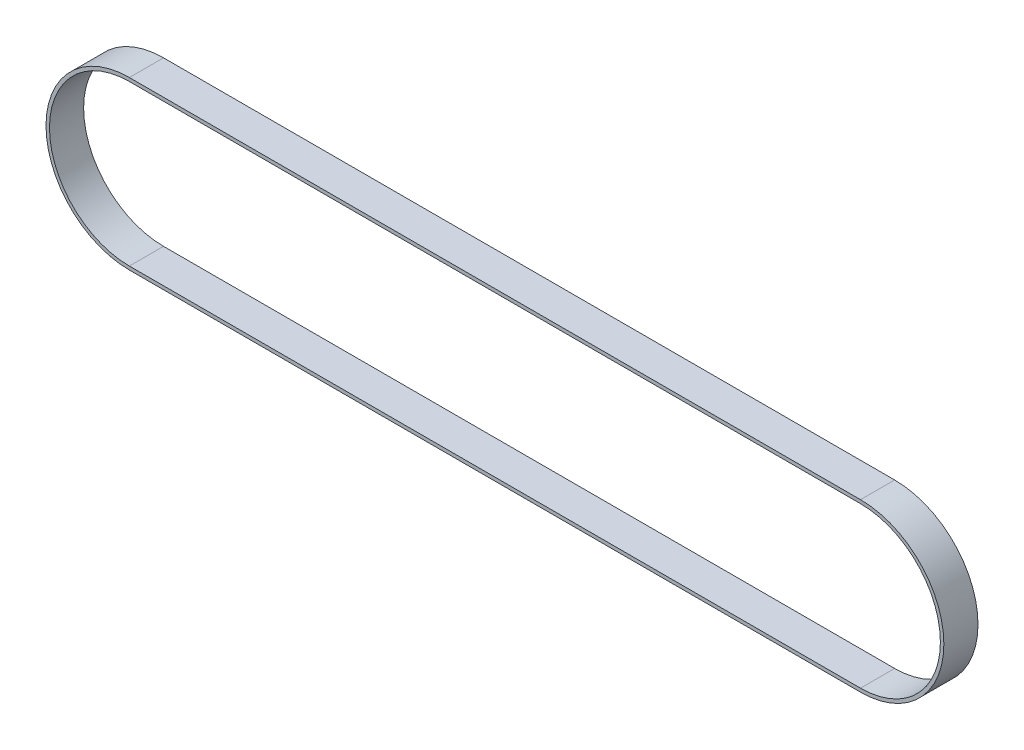
ISO-10303-21;
HEADER;
FILE_DESCRIPTION(('STEP AP214'),'2;1');
FILE_NAME('part.step','',(''),(''),'','','');
FILE_SCHEMA(('AUTOMOTIVE_DESIGN { 1 0 10303 214 1 1 1 1 }'));
ENDSEC;
DATA;
#1=APPLICATION_CONTEXT('core data for automotive mechanical design processes');
#2=APPLICATION_PROTOCOL_DEFINITION('international standard','automotive_design',2000,#1);
#3=PRODUCT_CONTEXT('',#1,'mechanical');
#4=PRODUCT('Part','Part','',(#3));
#5=PRODUCT_RELATED_PRODUCT_CATEGORY('part','',(#4));
#6=PRODUCT_DEFINITION_FORMATION('','',#4);
#7=PRODUCT_DEFINITION_CONTEXT('part definition',#1,'design');
#8=PRODUCT_DEFINITION('design','',#6,#7);
#9=PRODUCT_DEFINITION_SHAPE('','',#8);
#10=(LENGTH_UNIT() NAMED_UNIT(*) SI_UNIT(.MILLI.,.METRE.));
#11=(NAMED_UNIT(*) PLANE_ANGLE_UNIT() SI_UNIT($,.RADIAN.));
#12=(NAMED_UNIT(*) SI_UNIT($,.STERADIAN.) SOLID_ANGLE_UNIT());
#13=UNCERTAINTY_MEASURE_WITH_UNIT(LENGTH_MEASURE(1.E-05),#10,'distance_accuracy_value','');
#14=(GEOMETRIC_REPRESENTATION_CONTEXT(3) GLOBAL_UNCERTAINTY_ASSIGNED_CONTEXT((#13)) GLOBAL_UNIT_ASSIGNED_CONTEXT((#10,
#11,#12)) REPRESENTATION_CONTEXT('',''));
#15=CARTESIAN_POINT('',(0.,0.,0.));
#16=DIRECTION('',(0.,0.,1.));
#17=DIRECTION('',(1.,0.,0.));
#18=AXIS2_PLACEMENT_3D('',#15,#16,#17);
#19=CARTESIAN_POINT('',(0.,0.,14.986));
#20=DIRECTION('',(0.,0.,-1.));
#21=DIRECTION('',(-1.,0.,0.));
#22=AXIS2_PLACEMENT_3D('',#19,#20,#21);
#23=PLANE('',#22);
#24=CARTESIAN_POINT('',(0.,0.,14.986));
#25=DIRECTION('',(0.,0.,1.));
#26=DIRECTION('',(-1.,0.,0.));
#27=AXIS2_PLACEMENT_3D('',#24,#25,#26);
#28=CIRCLE('',#27,36.576);
#29=CARTESIAN_POINT('',(0.,-36.576,14.986));
#30=VERTEX_POINT('',#29);
#31=CARTESIAN_POINT('',(0.,36.5760000000001,14.986));
#32=VERTEX_POINT('',#31);
#33=EDGE_CURVE('E136',#30,#32,#28,.T.);
#34=ORIENTED_EDGE('',*,*,#33,.T.);
#35=DIRECTION('',(-1.,0.,0.));
#36=VECTOR('',#35,1.);
#37=CARTESIAN_POINT('',(0.,36.5760000000001,14.986));
#38=LINE('',#37,#36);
#39=CARTESIAN_POINT('',(-320.802,36.576,14.986));
#40=VERTEX_POINT('',#39);
#41=EDGE_CURVE('E139',#32,#40,#38,.T.);
#42=ORIENTED_EDGE('',*,*,#41,.T.);
#43=CARTESIAN_POINT('',(-320.802,0.,14.986));
#44=DIRECTION('',(0.,0.,1.));
#45=DIRECTION('',(1.,0.,0.));
#46=AXIS2_PLACEMENT_3D('',#43,#44,#45);
#47=CIRCLE('',#46,36.576);
#48=CARTESIAN_POINT('',(-320.802,-36.576,14.986));
#49=VERTEX_POINT('',#48);
#50=EDGE_CURVE('E142',#40,#49,#47,.T.);
#51=ORIENTED_EDGE('',*,*,#50,.T.);
#52=DIRECTION('',(1.,0.,0.));
#53=VECTOR('',#52,1.);
#54=CARTESIAN_POINT('',(0.,-36.576,14.986));
#55=LINE('',#54,#53);
#56=EDGE_CURVE('E144',#49,#30,#55,.T.);
#57=ORIENTED_EDGE('',*,*,#56,.T.);
#58=EDGE_LOOP('',(#34,#42,#51,#57));
#59=FACE_BOUND('',#58,.T.);
#60=CARTESIAN_POINT('',(0.,0.,14.986));
#61=DIRECTION('',(0.,0.,1.));
#62=DIRECTION('',(-1.,0.,0.));
#63=AXIS2_PLACEMENT_3D('',#60,#61,#62);
#64=CIRCLE('',#63,35.052);
#65=CARTESIAN_POINT('',(0.,-35.052,14.986));
#66=VERTEX_POINT('',#65);
#67=CARTESIAN_POINT('',(0.,35.052,14.986));
#68=VERTEX_POINT('',#67);
#69=EDGE_CURVE('E100',#66,#68,#64,.T.);
#70=ORIENTED_EDGE('',*,*,#69,.F.);
#71=DIRECTION('',(1.,0.,0.));
#72=VECTOR('',#71,1.);
#73=CARTESIAN_POINT('',(0.,-35.052,14.986));
#74=LINE('',#73,#72);
#75=CARTESIAN_POINT('',(-320.802,-35.052,14.986));
#76=VERTEX_POINT('',#75);
#77=EDGE_CURVE('E122',#76,#66,#74,.T.);
#78=ORIENTED_EDGE('',*,*,#77,.F.);
#79=CARTESIAN_POINT('',(-320.802,0.,14.986));
#80=DIRECTION('',(0.,0.,1.));
#81=DIRECTION('',(1.,0.,0.));
#82=AXIS2_PLACEMENT_3D('',#79,#80,#81);
#83=CIRCLE('',#82,35.052);
#84=CARTESIAN_POINT('',(-320.802,35.052,14.986));
#85=VERTEX_POINT('',#84);
#86=EDGE_CURVE('E120',#85,#76,#83,.T.);
#87=ORIENTED_EDGE('',*,*,#86,.F.);
#88=DIRECTION('',(-1.,0.,0.));
#89=VECTOR('',#88,1.);
#90=CARTESIAN_POINT('',(0.,35.052,14.986));
#91=LINE('',#90,#89);
#92=EDGE_CURVE('E108',#68,#85,#91,.T.);
#93=ORIENTED_EDGE('',*,*,#92,.F.);
#94=EDGE_LOOP('',(#70,#78,#87,#93));
#95=FACE_BOUND('',#94,.T.);
#96=ADVANCED_FACE('F35',(#59,#95),#23,.F.);
#97=CARTESIAN_POINT('',(0.,0.,0.));
#98=DIRECTION('',(0.,0.,-1.));
#99=DIRECTION('',(-1.,0.,0.));
#100=AXIS2_PLACEMENT_3D('',#97,#98,#99);
#101=PLANE('',#100);
#102=CARTESIAN_POINT('',(0.,0.,0.));
#103=DIRECTION('',(0.,0.,1.));
#104=DIRECTION('',(-1.,0.,0.));
#105=AXIS2_PLACEMENT_3D('',#102,#103,#104);
#106=CIRCLE('',#105,36.576);
#107=CARTESIAN_POINT('',(0.,-36.576,0.));
#108=VERTEX_POINT('',#107);
#109=CARTESIAN_POINT('',(0.,36.5760000000001,0.));
#110=VERTEX_POINT('',#109);
#111=EDGE_CURVE('E116',#108,#110,#106,.T.);
#112=ORIENTED_EDGE('',*,*,#111,.F.);
#113=DIRECTION('',(1.,0.,0.));
#114=VECTOR('',#113,1.);
#115=CARTESIAN_POINT('',(0.,-36.576,0.));
#116=LINE('',#115,#114);
#117=CARTESIAN_POINT('',(-320.802,-36.576,0.));
#118=VERTEX_POINT('',#117);
#119=EDGE_CURVE('E140',#118,#108,#116,.T.);
#120=ORIENTED_EDGE('',*,*,#119,.F.);
#121=CARTESIAN_POINT('',(-320.802,0.,0.));
#122=DIRECTION('',(0.,0.,1.));
#123=DIRECTION('',(1.,0.,0.));
#124=AXIS2_PLACEMENT_3D('',#121,#122,#123);
#125=CIRCLE('',#124,36.576);
#126=CARTESIAN_POINT('',(-320.802,36.576,0.));
#127=VERTEX_POINT('',#126);
#128=EDGE_CURVE('E151',#127,#118,#125,.T.);
#129=ORIENTED_EDGE('',*,*,#128,.F.);
#130=DIRECTION('',(-1.,0.,0.));
#131=VECTOR('',#130,1.);
#132=CARTESIAN_POINT('',(0.,36.5760000000001,0.));
#133=LINE('',#132,#131);
#134=EDGE_CURVE('E149',#110,#127,#133,.T.);
#135=ORIENTED_EDGE('',*,*,#134,.F.);
#136=EDGE_LOOP('',(#112,#120,#129,#135));
#137=FACE_BOUND('',#136,.T.);
#138=DIRECTION('',(1.,0.,0.));
#139=VECTOR('',#138,1.);
#140=CARTESIAN_POINT('',(0.,-35.052,0.));
#141=LINE('',#140,#139);
#142=CARTESIAN_POINT('',(-320.802,-35.052,0.));
#143=VERTEX_POINT('',#142);
#144=CARTESIAN_POINT('',(0.,-35.052,0.));
#145=VERTEX_POINT('',#144);
#146=EDGE_CURVE('E109',#143,#145,#141,.T.);
#147=ORIENTED_EDGE('',*,*,#146,.T.);
#148=CARTESIAN_POINT('',(0.,0.,0.));
#149=DIRECTION('',(0.,0.,1.));
#150=DIRECTION('',(-1.,0.,0.));
#151=AXIS2_PLACEMENT_3D('',#148,#149,#150);
#152=CIRCLE('',#151,35.052);
#153=CARTESIAN_POINT('',(0.,35.052,0.));
#154=VERTEX_POINT('',#153);
#155=EDGE_CURVE('E58',#145,#154,#152,.T.);
#156=ORIENTED_EDGE('',*,*,#155,.T.);
#157=DIRECTION('',(-1.,0.,0.));
#158=VECTOR('',#157,1.);
#159=CARTESIAN_POINT('',(0.,35.052,0.));
#160=LINE('',#159,#158);
#161=CARTESIAN_POINT('',(-320.802,35.052,0.));
#162=VERTEX_POINT('',#161);
#163=EDGE_CURVE('E115',#154,#162,#160,.T.);
#164=ORIENTED_EDGE('',*,*,#163,.T.);
#165=CARTESIAN_POINT('',(-320.802,0.,0.));
#166=DIRECTION('',(0.,0.,1.));
#167=DIRECTION('',(1.,0.,0.));
#168=AXIS2_PLACEMENT_3D('',#165,#166,#167);
#169=CIRCLE('',#168,35.052);
#170=EDGE_CURVE('E128',#162,#143,#169,.T.);
#171=ORIENTED_EDGE('',*,*,#170,.T.);
#172=EDGE_LOOP('',(#147,#156,#164,#171));
#173=FACE_BOUND('',#172,.T.);
#174=ADVANCED_FACE('F169',(#137,#173),#101,.T.);
#175=CARTESIAN_POINT('',(0.,0.,14.986));
#176=DIRECTION('',(0.,0.,-1.));
#177=DIRECTION('',(-1.,0.,0.));
#178=AXIS2_PLACEMENT_3D('',#175,#176,#177);
#179=CYLINDRICAL_SURFACE('',#178,36.576);
#180=ORIENTED_EDGE('',*,*,#111,.T.);
#181=DIRECTION('',(0.,0.,-1.));
#182=VECTOR('',#181,1.);
#183=CARTESIAN_POINT('',(0.,36.5760000000001,14.986));
#184=LINE('',#183,#182);
#185=EDGE_CURVE('E11',#32,#110,#184,.T.);
#186=ORIENTED_EDGE('',*,*,#185,.F.);
#187=ORIENTED_EDGE('',*,*,#33,.F.);
#188=DIRECTION('',(0.,0.,-1.));
#189=VECTOR('',#188,1.);
#190=CARTESIAN_POINT('',(0.,-36.576,14.986));
#191=LINE('',#190,#189);
#192=EDGE_CURVE('E146',#30,#108,#191,.T.);
#193=ORIENTED_EDGE('',*,*,#192,.T.);
#194=EDGE_LOOP('',(#180,#186,#187,#193));
#195=FACE_BOUND('',#194,.T.);
#196=ADVANCED_FACE('F37',(#195),#179,.T.);
#197=CARTESIAN_POINT('',(0.,36.5760000000001,14.986));
#198=DIRECTION('',(0.,-1.,0.));
#199=DIRECTION('',(1.,0.,0.));
#200=AXIS2_PLACEMENT_3D('',#197,#198,#199);
#201=PLANE('',#200);
#202=ORIENTED_EDGE('',*,*,#134,.T.);
#203=DIRECTION('',(0.,0.,-1.));
#204=VECTOR('',#203,1.);
#205=CARTESIAN_POINT('',(-320.802,36.576,14.986));
#206=LINE('',#205,#204);
#207=EDGE_CURVE('E43',#40,#127,#206,.T.);
#208=ORIENTED_EDGE('',*,*,#207,.F.);
#209=ORIENTED_EDGE('',*,*,#41,.F.);
#210=ORIENTED_EDGE('',*,*,#185,.T.);
#211=EDGE_LOOP('',(#202,#208,#209,#210));
#212=FACE_BOUND('',#211,.T.);
#213=ADVANCED_FACE('F179',(#212),#201,.F.);
#214=CARTESIAN_POINT('',(-320.802,0.,14.986));
#215=DIRECTION('',(0.,0.,-1.));
#216=DIRECTION('',(-1.,0.,0.));
#217=AXIS2_PLACEMENT_3D('',#214,#215,#216);
#218=CYLINDRICAL_SURFACE('',#217,36.576);
#219=ORIENTED_EDGE('',*,*,#128,.T.);
#220=DIRECTION('',(0.,0.,-1.));
#221=VECTOR('',#220,1.);
#222=CARTESIAN_POINT('',(-320.802,-36.576,14.986));
#223=LINE('',#222,#221);
#224=EDGE_CURVE('E156',#49,#118,#223,.T.);
#225=ORIENTED_EDGE('',*,*,#224,.F.);
#226=ORIENTED_EDGE('',*,*,#50,.F.);
#227=ORIENTED_EDGE('',*,*,#207,.T.);
#228=EDGE_LOOP('',(#219,#225,#226,#227));
#229=FACE_BOUND('',#228,.T.);
#230=ADVANCED_FACE('F163',(#229),#218,.T.);
#231=CARTESIAN_POINT('',(0.,-36.576,14.986));
#232=DIRECTION('',(0.,1.,0.));
#233=DIRECTION('',(-1.,0.,0.));
#234=AXIS2_PLACEMENT_3D('',#231,#232,#233);
#235=PLANE('',#234);
#236=ORIENTED_EDGE('',*,*,#119,.T.);
#237=ORIENTED_EDGE('',*,*,#192,.F.);
#238=ORIENTED_EDGE('',*,*,#56,.F.);
#239=ORIENTED_EDGE('',*,*,#224,.T.);
#240=EDGE_LOOP('',(#236,#237,#238,#239));
#241=FACE_BOUND('',#240,.T.);
#242=ADVANCED_FACE('F173',(#241),#235,.F.);
#243=CARTESIAN_POINT('',(0.,0.,14.986));
#244=DIRECTION('',(0.,0.,-1.));
#245=DIRECTION('',(-1.,0.,0.));
#246=AXIS2_PLACEMENT_3D('',#243,#244,#245);
#247=CYLINDRICAL_SURFACE('',#246,35.052);
#248=ORIENTED_EDGE('',*,*,#155,.F.);
#249=DIRECTION('',(0.,0.,-1.));
#250=VECTOR('',#249,1.);
#251=CARTESIAN_POINT('',(0.,-35.052,14.986));
#252=LINE('',#251,#250);
#253=EDGE_CURVE('E104',#66,#145,#252,.T.);
#254=ORIENTED_EDGE('',*,*,#253,.F.);
#255=ORIENTED_EDGE('',*,*,#69,.T.);
#256=DIRECTION('',(0.,0.,-1.));
#257=VECTOR('',#256,1.);
#258=CARTESIAN_POINT('',(0.,35.052,14.986));
#259=LINE('',#258,#257);
#260=EDGE_CURVE('E103',#68,#154,#259,.T.);
#261=ORIENTED_EDGE('',*,*,#260,.T.);
#262=EDGE_LOOP('',(#248,#254,#255,#261));
#263=FACE_BOUND('',#262,.T.);
#264=ADVANCED_FACE('F102',(#263),#247,.F.);
#265=CARTESIAN_POINT('',(0.,35.052,14.986));
#266=DIRECTION('',(0.,-1.,0.));
#267=DIRECTION('',(1.,0.,0.));
#268=AXIS2_PLACEMENT_3D('',#265,#266,#267);
#269=PLANE('',#268);
#270=ORIENTED_EDGE('',*,*,#163,.F.);
#271=ORIENTED_EDGE('',*,*,#260,.F.);
#272=ORIENTED_EDGE('',*,*,#92,.T.);
#273=DIRECTION('',(0.,0.,-1.));
#274=VECTOR('',#273,1.);
#275=CARTESIAN_POINT('',(-320.802,35.052,14.986));
#276=LINE('',#275,#274);
#277=EDGE_CURVE('E117',#85,#162,#276,.T.);
#278=ORIENTED_EDGE('',*,*,#277,.T.);
#279=EDGE_LOOP('',(#270,#271,#272,#278));
#280=FACE_BOUND('',#279,.T.);
#281=ADVANCED_FACE('F112',(#280),#269,.T.);
#282=CARTESIAN_POINT('',(-320.802,0.,14.986));
#283=DIRECTION('',(0.,0.,-1.));
#284=DIRECTION('',(-1.,0.,0.));
#285=AXIS2_PLACEMENT_3D('',#282,#283,#284);
#286=CYLINDRICAL_SURFACE('',#285,35.052);
#287=ORIENTED_EDGE('',*,*,#170,.F.);
#288=ORIENTED_EDGE('',*,*,#277,.F.);
#289=ORIENTED_EDGE('',*,*,#86,.T.);
#290=DIRECTION('',(0.,0.,-1.));
#291=VECTOR('',#290,1.);
#292=CARTESIAN_POINT('',(-320.802,-35.052,14.986));
#293=LINE('',#292,#291);
#294=EDGE_CURVE('E50',#76,#143,#293,.T.);
#295=ORIENTED_EDGE('',*,*,#294,.T.);
#296=EDGE_LOOP('',(#287,#288,#289,#295));
#297=FACE_BOUND('',#296,.T.);
#298=ADVANCED_FACE('F202',(#297),#286,.F.);
#299=CARTESIAN_POINT('',(0.,-35.052,14.986));
#300=DIRECTION('',(0.,1.,0.));
#301=DIRECTION('',(-1.,0.,0.));
#302=AXIS2_PLACEMENT_3D('',#299,#300,#301);
#303=PLANE('',#302);
#304=ORIENTED_EDGE('',*,*,#146,.F.);
#305=ORIENTED_EDGE('',*,*,#294,.F.);
#306=ORIENTED_EDGE('',*,*,#77,.T.);
#307=ORIENTED_EDGE('',*,*,#253,.T.);
#308=EDGE_LOOP('',(#304,#305,#306,#307));
#309=FACE_BOUND('',#308,.T.);
#310=ADVANCED_FACE('F206',(#309),#303,.T.);
#311=CLOSED_SHELL('',(#96,#174,#196,#213,#230,#242,#264,#281,#298,#310));
#312=MANIFOLD_SOLID_BREP('B2',#311);
#313=ADVANCED_BREP_SHAPE_REPRESENTATION('',(#18,#312),#14);
#314=SHAPE_DEFINITION_REPRESENTATION(#9,#313);
ENDSEC;
END-ISO-10303-21;
